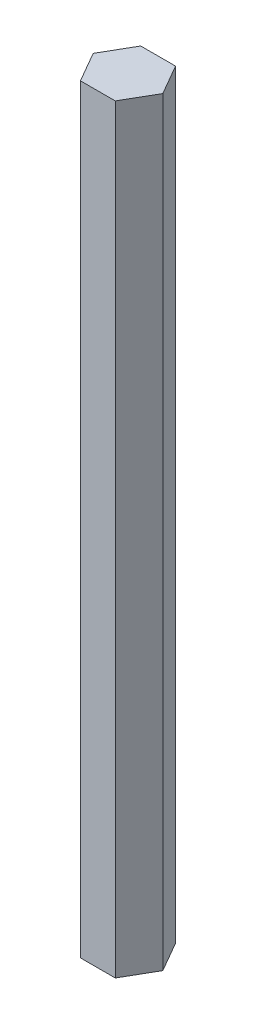
ISO-10303-21;
HEADER;
FILE_DESCRIPTION(('STEP AP214'),'2;1');
FILE_NAME('part.step','',(''),(''),'','','');
FILE_SCHEMA(('AUTOMOTIVE_DESIGN { 1 0 10303 214 1 1 1 1 }'));
ENDSEC;
DATA;
#1=APPLICATION_CONTEXT('core data for automotive mechanical design processes');
#2=APPLICATION_PROTOCOL_DEFINITION('international standard','automotive_design',2000,#1);
#3=PRODUCT_CONTEXT('',#1,'mechanical');
#4=PRODUCT('Part','Part','',(#3));
#5=PRODUCT_RELATED_PRODUCT_CATEGORY('part','',(#4));
#6=PRODUCT_DEFINITION_FORMATION('','',#4);
#7=PRODUCT_DEFINITION_CONTEXT('part definition',#1,'design');
#8=PRODUCT_DEFINITION('design','',#6,#7);
#9=PRODUCT_DEFINITION_SHAPE('','',#8);
#10=(LENGTH_UNIT() NAMED_UNIT(*) SI_UNIT(.MILLI.,.METRE.));
#11=(NAMED_UNIT(*) PLANE_ANGLE_UNIT() SI_UNIT($,.RADIAN.));
#12=(NAMED_UNIT(*) SI_UNIT($,.STERADIAN.) SOLID_ANGLE_UNIT());
#13=UNCERTAINTY_MEASURE_WITH_UNIT(LENGTH_MEASURE(1.E-05),#10,'distance_accuracy_value','');
#14=(GEOMETRIC_REPRESENTATION_CONTEXT(3) GLOBAL_UNCERTAINTY_ASSIGNED_CONTEXT((#13)) GLOBAL_UNIT_ASSIGNED_CONTEXT((#10,
#11,#12)) REPRESENTATION_CONTEXT('',''));
#15=CARTESIAN_POINT('',(0.,0.,0.));
#16=DIRECTION('',(0.,0.,1.));
#17=DIRECTION('',(1.,0.,0.));
#18=AXIS2_PLACEMENT_3D('',#15,#16,#17);
#19=CARTESIAN_POINT('',(3.66617420935419,160.,6.34999999999995));
#20=DIRECTION('',(-0.866025403784442,0.,-0.499999999999995));
#21=DIRECTION('',(-0.499999999999995,0.,0.866025403784442));
#22=AXIS2_PLACEMENT_3D('',#19,#20,#21);
#23=PLANE('',#22);
#24=DIRECTION('',(0.499999999999995,0.,-0.866025403784442));
#25=VECTOR('',#24,1.);
#26=CARTESIAN_POINT('',(3.66617420935419,0.,6.34999999999995));
#27=LINE('',#26,#25);
#28=CARTESIAN_POINT('',(3.66617420935419,0.,6.34999999999995));
#29=VERTEX_POINT('',#28);
#30=CARTESIAN_POINT('',(7.33234841870824,0.,0.));
#31=VERTEX_POINT('',#30);
#32=EDGE_CURVE('E128',#29,#31,#27,.T.);
#33=ORIENTED_EDGE('',*,*,#32,.T.);
#34=DIRECTION('',(0.,-1.,0.));
#35=VECTOR('',#34,1.);
#36=CARTESIAN_POINT('',(7.33234841870824,160.,0.));
#37=LINE('',#36,#35);
#38=CARTESIAN_POINT('',(7.33234841870824,160.,0.));
#39=VERTEX_POINT('',#38);
#40=EDGE_CURVE('E11',#39,#31,#37,.T.);
#41=ORIENTED_EDGE('',*,*,#40,.F.);
#42=DIRECTION('',(0.499999999999995,0.,-0.866025403784442));
#43=VECTOR('',#42,1.);
#44=CARTESIAN_POINT('',(3.66617420935419,160.,6.34999999999995));
#45=LINE('',#44,#43);
#46=CARTESIAN_POINT('',(3.66617420935419,160.,6.34999999999995));
#47=VERTEX_POINT('',#46);
#48=EDGE_CURVE('E144',#47,#39,#45,.T.);
#49=ORIENTED_EDGE('',*,*,#48,.F.);
#50=DIRECTION('',(0.,-1.,0.));
#51=VECTOR('',#50,1.);
#52=CARTESIAN_POINT('',(3.66617420935419,160.,6.34999999999995));
#53=LINE('',#52,#51);
#54=EDGE_CURVE('E124',#47,#29,#53,.T.);
#55=ORIENTED_EDGE('',*,*,#54,.T.);
#56=EDGE_LOOP('',(#33,#41,#49,#55));
#57=FACE_BOUND('',#56,.T.);
#58=ADVANCED_FACE('F39',(#57),#23,.F.);
#59=CARTESIAN_POINT('',(7.33234841870824,160.,0.));
#60=DIRECTION('',(-0.866025403784438,0.,0.500000000000001));
#61=DIRECTION('',(0.500000000000001,0.,0.866025403784438));
#62=AXIS2_PLACEMENT_3D('',#59,#60,#61);
#63=PLANE('',#62);
#64=DIRECTION('',(-0.500000000000001,0.,-0.866025403784438));
#65=VECTOR('',#64,1.);
#66=CARTESIAN_POINT('',(7.33234841870824,0.,0.));
#67=LINE('',#66,#65);
#68=CARTESIAN_POINT('',(3.6661742093541,0.,-6.35));
#69=VERTEX_POINT('',#68);
#70=EDGE_CURVE('E132',#31,#69,#67,.T.);
#71=ORIENTED_EDGE('',*,*,#70,.T.);
#72=DIRECTION('',(0.,-1.,0.));
#73=VECTOR('',#72,1.);
#74=CARTESIAN_POINT('',(3.6661742093541,160.,-6.35));
#75=LINE('',#74,#73);
#76=CARTESIAN_POINT('',(3.6661742093541,160.,-6.35));
#77=VERTEX_POINT('',#76);
#78=EDGE_CURVE('E48',#77,#69,#75,.T.);
#79=ORIENTED_EDGE('',*,*,#78,.F.);
#80=DIRECTION('',(-0.500000000000001,0.,-0.866025403784438));
#81=VECTOR('',#80,1.);
#82=CARTESIAN_POINT('',(7.33234841870824,160.,0.));
#83=LINE('',#82,#81);
#84=EDGE_CURVE('E93',#39,#77,#83,.T.);
#85=ORIENTED_EDGE('',*,*,#84,.F.);
#86=ORIENTED_EDGE('',*,*,#40,.T.);
#87=EDGE_LOOP('',(#71,#79,#85,#86));
#88=FACE_BOUND('',#87,.T.);
#89=ADVANCED_FACE('F172',(#88),#63,.F.);
#90=CARTESIAN_POINT('',(3.6661742093541,160.,-6.35));
#91=DIRECTION('',(0.,0.,1.));
#92=DIRECTION('',(1.,0.,0.));
#93=AXIS2_PLACEMENT_3D('',#90,#91,#92);
#94=PLANE('',#93);
#95=DIRECTION('',(-1.,0.,0.));
#96=VECTOR('',#95,1.);
#97=CARTESIAN_POINT('',(3.6661742093541,0.,-6.35));
#98=LINE('',#97,#96);
#99=CARTESIAN_POINT('',(-3.66617420935415,0.,-6.34999999999998));
#100=VERTEX_POINT('',#99);
#101=EDGE_CURVE('E135',#69,#100,#98,.T.);
#102=ORIENTED_EDGE('',*,*,#101,.T.);
#103=DIRECTION('',(0.,-1.,0.));
#104=VECTOR('',#103,1.);
#105=CARTESIAN_POINT('',(-3.66617420935415,160.,-6.34999999999998));
#106=LINE('',#105,#104);
#107=CARTESIAN_POINT('',(-3.66617420935415,160.,-6.34999999999998));
#108=VERTEX_POINT('',#107);
#109=EDGE_CURVE('E117',#108,#100,#106,.T.);
#110=ORIENTED_EDGE('',*,*,#109,.F.);
#111=DIRECTION('',(-1.,0.,0.));
#112=VECTOR('',#111,1.);
#113=CARTESIAN_POINT('',(3.6661742093541,160.,-6.35));
#114=LINE('',#113,#112);
#115=EDGE_CURVE('E106',#77,#108,#114,.T.);
#116=ORIENTED_EDGE('',*,*,#115,.F.);
#117=ORIENTED_EDGE('',*,*,#78,.T.);
#118=EDGE_LOOP('',(#102,#110,#116,#117));
#119=FACE_BOUND('',#118,.T.);
#120=ADVANCED_FACE('F154',(#119),#94,.F.);
#121=CARTESIAN_POINT('',(-3.66617420935415,160.,-6.34999999999998));
#122=DIRECTION('',(0.866025403784442,0.,0.499999999999995));
#123=DIRECTION('',(0.499999999999995,0.,-0.866025403784442));
#124=AXIS2_PLACEMENT_3D('',#121,#122,#123);
#125=PLANE('',#124);
#126=DIRECTION('',(-0.499999999999995,0.,0.866025403784442));
#127=VECTOR('',#126,1.);
#128=CARTESIAN_POINT('',(-3.66617420935415,0.,-6.34999999999998));
#129=LINE('',#128,#127);
#130=CARTESIAN_POINT('',(-7.33234841870824,0.,0.));
#131=VERTEX_POINT('',#130);
#132=EDGE_CURVE('E115',#100,#131,#129,.T.);
#133=ORIENTED_EDGE('',*,*,#132,.T.);
#134=DIRECTION('',(0.,-1.,0.));
#135=VECTOR('',#134,1.);
#136=CARTESIAN_POINT('',(-7.33234841870824,160.,0.));
#137=LINE('',#136,#135);
#138=CARTESIAN_POINT('',(-7.33234841870824,160.,0.));
#139=VERTEX_POINT('',#138);
#140=EDGE_CURVE('E112',#139,#131,#137,.T.);
#141=ORIENTED_EDGE('',*,*,#140,.F.);
#142=DIRECTION('',(-0.499999999999995,0.,0.866025403784442));
#143=VECTOR('',#142,1.);
#144=CARTESIAN_POINT('',(-3.66617420935415,160.,-6.34999999999998));
#145=LINE('',#144,#143);
#146=EDGE_CURVE('E100',#108,#139,#145,.T.);
#147=ORIENTED_EDGE('',*,*,#146,.F.);
#148=ORIENTED_EDGE('',*,*,#109,.T.);
#149=EDGE_LOOP('',(#133,#141,#147,#148));
#150=FACE_BOUND('',#149,.T.);
#151=ADVANCED_FACE('F113',(#150),#125,.F.);
#152=CARTESIAN_POINT('',(-7.33234841870824,160.,0.));
#153=DIRECTION('',(0.866025403784435,0.,-0.500000000000007));
#154=DIRECTION('',(-0.500000000000007,0.,-0.866025403784435));
#155=AXIS2_PLACEMENT_3D('',#152,#153,#154);
#156=PLANE('',#155);
#157=DIRECTION('',(0.500000000000007,0.,0.866025403784435));
#158=VECTOR('',#157,1.);
#159=CARTESIAN_POINT('',(-7.33234841870824,0.,0.));
#160=LINE('',#159,#158);
#161=CARTESIAN_POINT('',(-3.66617420935406,0.,6.35000000000003));
#162=VERTEX_POINT('',#161);
#163=EDGE_CURVE('E79',#131,#162,#160,.T.);
#164=ORIENTED_EDGE('',*,*,#163,.T.);
#165=DIRECTION('',(0.,-1.,0.));
#166=VECTOR('',#165,1.);
#167=CARTESIAN_POINT('',(-3.66617420935406,160.,6.35000000000003));
#168=LINE('',#167,#166);
#169=CARTESIAN_POINT('',(-3.66617420935406,160.,6.35000000000003));
#170=VERTEX_POINT('',#169);
#171=EDGE_CURVE('E118',#170,#162,#168,.T.);
#172=ORIENTED_EDGE('',*,*,#171,.F.);
#173=DIRECTION('',(0.500000000000007,0.,0.866025403784435));
#174=VECTOR('',#173,1.);
#175=CARTESIAN_POINT('',(-7.33234841870824,160.,0.));
#176=LINE('',#175,#174);
#177=EDGE_CURVE('E104',#139,#170,#176,.T.);
#178=ORIENTED_EDGE('',*,*,#177,.F.);
#179=ORIENTED_EDGE('',*,*,#140,.T.);
#180=EDGE_LOOP('',(#164,#172,#178,#179));
#181=FACE_BOUND('',#180,.T.);
#182=ADVANCED_FACE('F120',(#181),#156,.F.);
#183=CARTESIAN_POINT('',(-3.66617420935406,160.,6.35000000000003));
#184=DIRECTION('',(0.,0.,-1.));
#185=DIRECTION('',(-1.,0.,0.));
#186=AXIS2_PLACEMENT_3D('',#183,#184,#185);
#187=PLANE('',#186);
#188=DIRECTION('',(1.,0.,0.));
#189=VECTOR('',#188,1.);
#190=CARTESIAN_POINT('',(-3.66617420935406,0.,6.35000000000003));
#191=LINE('',#190,#189);
#192=EDGE_CURVE('E85',#162,#29,#191,.T.);
#193=ORIENTED_EDGE('',*,*,#192,.T.);
#194=ORIENTED_EDGE('',*,*,#54,.F.);
#195=DIRECTION('',(1.,0.,0.));
#196=VECTOR('',#195,1.);
#197=CARTESIAN_POINT('',(-3.66617420935406,160.,6.35000000000003));
#198=LINE('',#197,#196);
#199=EDGE_CURVE('E56',#170,#47,#198,.T.);
#200=ORIENTED_EDGE('',*,*,#199,.F.);
#201=ORIENTED_EDGE('',*,*,#171,.T.);
#202=EDGE_LOOP('',(#193,#194,#200,#201));
#203=FACE_BOUND('',#202,.T.);
#204=ADVANCED_FACE('F161',(#203),#187,.F.);
#205=CARTESIAN_POINT('',(0.,160.,0.));
#206=DIRECTION('',(0.,1.,0.));
#207=DIRECTION('',(0.,0.,1.));
#208=AXIS2_PLACEMENT_3D('',#205,#206,#207);
#209=PLANE('',#208);
#210=ORIENTED_EDGE('',*,*,#48,.T.);
#211=ORIENTED_EDGE('',*,*,#84,.T.);
#212=ORIENTED_EDGE('',*,*,#115,.T.);
#213=ORIENTED_EDGE('',*,*,#146,.T.);
#214=ORIENTED_EDGE('',*,*,#177,.T.);
#215=ORIENTED_EDGE('',*,*,#199,.T.);
#216=EDGE_LOOP('',(#210,#211,#212,#213,#214,#215));
#217=FACE_BOUND('',#216,.T.);
#218=ADVANCED_FACE('F102',(#217),#209,.T.);
#219=CARTESIAN_POINT('',(0.,0.,0.));
#220=DIRECTION('',(0.,1.,0.));
#221=DIRECTION('',(0.,0.,1.));
#222=AXIS2_PLACEMENT_3D('',#219,#220,#221);
#223=PLANE('',#222);
#224=ORIENTED_EDGE('',*,*,#32,.F.);
#225=ORIENTED_EDGE('',*,*,#192,.F.);
#226=ORIENTED_EDGE('',*,*,#163,.F.);
#227=ORIENTED_EDGE('',*,*,#132,.F.);
#228=ORIENTED_EDGE('',*,*,#101,.F.);
#229=ORIENTED_EDGE('',*,*,#70,.F.);
#230=EDGE_LOOP('',(#224,#225,#226,#227,#228,#229));
#231=FACE_BOUND('',#230,.T.);
#232=ADVANCED_FACE('F157',(#231),#223,.F.);
#233=CLOSED_SHELL('',(#58,#89,#120,#151,#182,#204,#218,#232));
#234=MANIFOLD_SOLID_BREP('B2',#233);
#235=ADVANCED_BREP_SHAPE_REPRESENTATION('',(#18,#234),#14);
#236=SHAPE_DEFINITION_REPRESENTATION(#9,#235);
ENDSEC;
END-ISO-10303-21;
